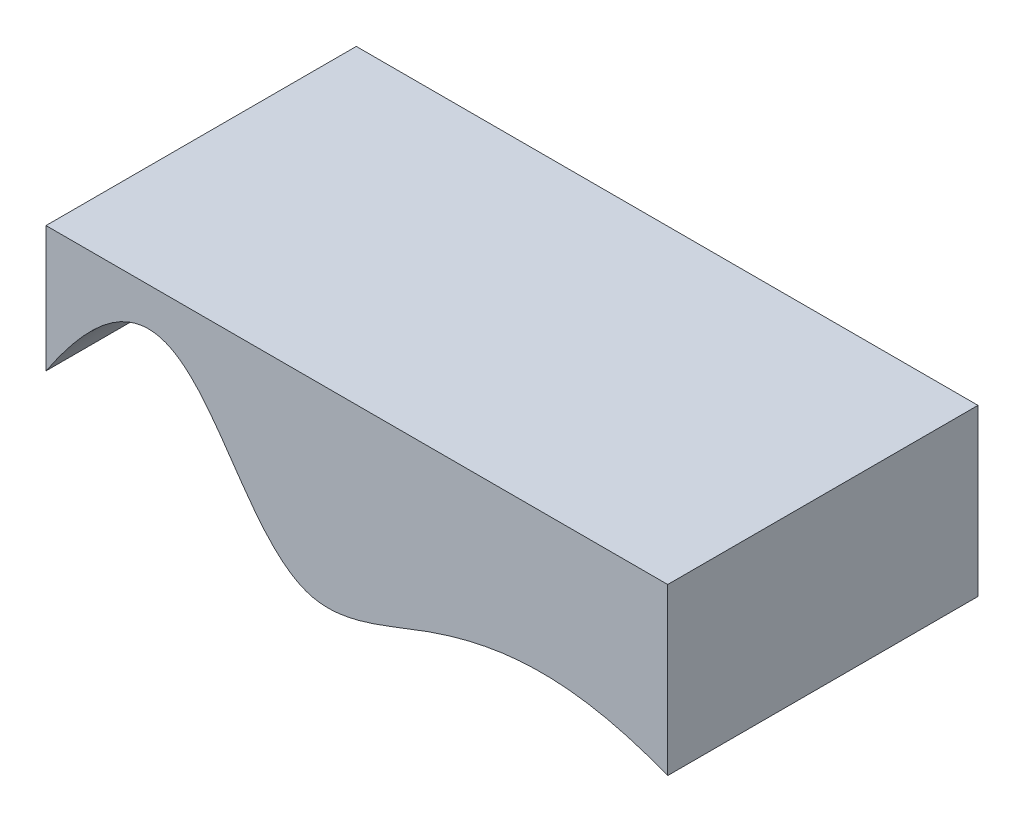
ISO-10303-21;
HEADER;
FILE_DESCRIPTION(('STEP AP214'),'2;1');
FILE_NAME('part.step','',(''),(''),'','','');
FILE_SCHEMA(('AUTOMOTIVE_DESIGN { 1 0 10303 214 1 1 1 1 }'));
ENDSEC;
DATA;
#1=APPLICATION_CONTEXT('core data for automotive mechanical design processes');
#2=APPLICATION_PROTOCOL_DEFINITION('international standard','automotive_design',2000,#1);
#3=PRODUCT_CONTEXT('',#1,'mechanical');
#4=PRODUCT('Part','Part','',(#3));
#5=PRODUCT_RELATED_PRODUCT_CATEGORY('part','',(#4));
#6=PRODUCT_DEFINITION_FORMATION('','',#4);
#7=PRODUCT_DEFINITION_CONTEXT('part definition',#1,'design');
#8=PRODUCT_DEFINITION('design','',#6,#7);
#9=PRODUCT_DEFINITION_SHAPE('','',#8);
#10=(LENGTH_UNIT() NAMED_UNIT(*) SI_UNIT(.MILLI.,.METRE.));
#11=(NAMED_UNIT(*) PLANE_ANGLE_UNIT() SI_UNIT($,.RADIAN.));
#12=(NAMED_UNIT(*) SI_UNIT($,.STERADIAN.) SOLID_ANGLE_UNIT());
#13=UNCERTAINTY_MEASURE_WITH_UNIT(LENGTH_MEASURE(1.E-05),#10,'distance_accuracy_value','');
#14=(GEOMETRIC_REPRESENTATION_CONTEXT(3) GLOBAL_UNCERTAINTY_ASSIGNED_CONTEXT((#13)) GLOBAL_UNIT_ASSIGNED_CONTEXT((#10,
#11,#12)) REPRESENTATION_CONTEXT('',''));
#15=CARTESIAN_POINT('',(0.,0.,0.));
#16=DIRECTION('',(0.,0.,1.));
#17=DIRECTION('',(1.,0.,0.));
#18=AXIS2_PLACEMENT_3D('',#15,#16,#17);
#19=CARTESIAN_POINT('',(-100.,40.5,-75.0911395420866));
#20=CARTESIAN_POINT('',(-53.0498171241233,111.136617538258,-75.0911395420866));
#21=CARTESIAN_POINT('',(-41.9028867763509,-1.15581028121237,-75.0911395420866));
#22=CARTESIAN_POINT('',(37.6600895294148,38.4643377224202,-75.0911395420866));
#23=CARTESIAN_POINT('',(71.5534586178328,38.9159371729205,-75.0911395420866));
#24=CARTESIAN_POINT('',(100.,27.7581215065662,-75.0911395420866));
#25=B_SPLINE_CURVE_WITH_KNOTS('',3,(#19,#20,#21,#22,#23,#24),.UNSPECIFIED.,.F.,.F.,(4,1,1,4),
(0.,0.479227824952904,0.645043655994682,1.),.UNSPECIFIED.);
#26=DIRECTION('',(0.,0.,1.));
#27=VECTOR('',#26,1.);
#28=SURFACE_OF_LINEAR_EXTRUSION('',#25,#27);
#29=DIRECTION('',(0.,0.,1.));
#30=VECTOR('',#29,1.);
#31=CARTESIAN_POINT('',(100.,27.7581215065662,-75.0911395420866));
#32=LINE('',#31,#30);
#33=CARTESIAN_POINT('',(100.,27.7581215065661,-49.9088604579134));
#34=VERTEX_POINT('',#33);
#35=CARTESIAN_POINT('',(100.,27.7581215065661,49.9088604579134));
#36=VERTEX_POINT('',#35);
#37=EDGE_CURVE('E126',#34,#36,#32,.T.);
#38=ORIENTED_EDGE('',*,*,#37,.T.);
#39=CARTESIAN_POINT('',(-100.,40.5,49.9088604579134));
#40=CARTESIAN_POINT('',(-53.0498171241233,111.136617538258,49.9088604579134));
#41=CARTESIAN_POINT('',(-41.9028867763509,-1.15581028121237,49.9088604579134));
#42=CARTESIAN_POINT('',(37.6600895294148,38.4643377224202,49.9088604579134));
#43=CARTESIAN_POINT('',(71.5534586178328,38.9159371729205,49.9088604579134));
#44=CARTESIAN_POINT('',(100.,27.7581215065662,49.9088604579134));
#45=B_SPLINE_CURVE_WITH_KNOTS('',3,(#39,#40,#41,#42,#43,#44),.UNSPECIFIED.,.F.,.F.,(4,1,1,4),
(0.,0.479227824952904,0.645043655994682,1.),.UNSPECIFIED.);
#46=CARTESIAN_POINT('',(-100.,40.5,49.9088604579134));
#47=VERTEX_POINT('',#46);
#48=EDGE_CURVE('E118',#36,#47,#45,.F.);
#49=ORIENTED_EDGE('',*,*,#48,.T.);
#50=DIRECTION('',(0.,0.,1.));
#51=VECTOR('',#50,1.);
#52=CARTESIAN_POINT('',(-100.,40.5,-75.0911395420866));
#53=LINE('',#52,#51);
#54=CARTESIAN_POINT('',(-100.,40.5,-49.9088604579134));
#55=VERTEX_POINT('',#54);
#56=EDGE_CURVE('E104',#47,#55,#53,.F.);
#57=ORIENTED_EDGE('',*,*,#56,.T.);
#58=CARTESIAN_POINT('',(-100.,40.5,-49.9088604579134));
#59=CARTESIAN_POINT('',(-53.0498171241233,111.136617538258,-49.9088604579134));
#60=CARTESIAN_POINT('',(-41.9028867763509,-1.15581028121237,-49.9088604579134));
#61=CARTESIAN_POINT('',(37.6600895294148,38.4643377224202,-49.9088604579134));
#62=CARTESIAN_POINT('',(71.5534586178328,38.9159371729205,-49.9088604579134));
#63=CARTESIAN_POINT('',(100.,27.7581215065662,-49.9088604579134));
#64=B_SPLINE_CURVE_WITH_KNOTS('',3,(#58,#59,#60,#61,#62,#63),.UNSPECIFIED.,.F.,.F.,(4,1,1,4),
(0.,0.479227824952904,0.645043655994682,1.),.UNSPECIFIED.);
#65=EDGE_CURVE('E116',#55,#34,#64,.T.);
#66=ORIENTED_EDGE('',*,*,#65,.T.);
#67=EDGE_LOOP('',(#38,#49,#57,#66));
#68=FACE_BOUND('',#67,.T.);
#69=ADVANCED_FACE('F59',(#68),#28,.T.);
#70=CARTESIAN_POINT('',(-100.,81.,49.9088604579134));
#71=DIRECTION('',(1.,0.,0.));
#72=DIRECTION('',(0.,0.,-1.));
#73=AXIS2_PLACEMENT_3D('',#70,#71,#72);
#74=PLANE('',#73);
#75=ORIENTED_EDGE('',*,*,#56,.F.);
#76=DIRECTION('',(0.,-1.,0.));
#77=VECTOR('',#76,1.);
#78=CARTESIAN_POINT('',(-100.,81.,49.9088604579134));
#79=LINE('',#78,#77);
#80=CARTESIAN_POINT('',(-100.,81.,49.9088604579134));
#81=VERTEX_POINT('',#80);
#82=EDGE_CURVE('E120',#81,#47,#79,.T.);
#83=ORIENTED_EDGE('',*,*,#82,.F.);
#84=DIRECTION('',(0.,0.,1.));
#85=VECTOR('',#84,1.);
#86=CARTESIAN_POINT('',(-100.,81.,49.9088604579134));
#87=LINE('',#86,#85);
#88=CARTESIAN_POINT('',(-100.,81.,-49.9088604579134));
#89=VERTEX_POINT('',#88);
#90=EDGE_CURVE('E12',#89,#81,#87,.T.);
#91=ORIENTED_EDGE('',*,*,#90,.F.);
#92=DIRECTION('',(0.,-1.,0.));
#93=VECTOR('',#92,1.);
#94=CARTESIAN_POINT('',(-100.,81.,-49.9088604579134));
#95=LINE('',#94,#93);
#96=EDGE_CURVE('E100',#89,#55,#95,.T.);
#97=ORIENTED_EDGE('',*,*,#96,.T.);
#98=EDGE_LOOP('',(#75,#83,#91,#97));
#99=FACE_BOUND('',#98,.T.);
#100=ADVANCED_FACE('F102',(#99),#74,.F.);
#101=CARTESIAN_POINT('',(-100.,81.,49.9088604579134));
#102=DIRECTION('',(0.,0.,-1.));
#103=DIRECTION('',(-1.,0.,0.));
#104=AXIS2_PLACEMENT_3D('',#101,#102,#103);
#105=PLANE('',#104);
#106=ORIENTED_EDGE('',*,*,#48,.F.);
#107=DIRECTION('',(0.,-1.,0.));
#108=VECTOR('',#107,1.);
#109=CARTESIAN_POINT('',(100.,81.,49.9088604579134));
#110=LINE('',#109,#108);
#111=CARTESIAN_POINT('',(100.,81.,49.9088604579134));
#112=VERTEX_POINT('',#111);
#113=EDGE_CURVE('E144',#112,#36,#110,.T.);
#114=ORIENTED_EDGE('',*,*,#113,.F.);
#115=DIRECTION('',(1.,0.,0.));
#116=VECTOR('',#115,1.);
#117=CARTESIAN_POINT('',(-100.,81.,49.9088604579134));
#118=LINE('',#117,#116);
#119=EDGE_CURVE('E70',#81,#112,#118,.T.);
#120=ORIENTED_EDGE('',*,*,#119,.F.);
#121=ORIENTED_EDGE('',*,*,#82,.T.);
#122=EDGE_LOOP('',(#106,#114,#120,#121));
#123=FACE_BOUND('',#122,.T.);
#124=ADVANCED_FACE('F159',(#123),#105,.F.);
#125=CARTESIAN_POINT('',(100.,81.,49.9088604579134));
#126=DIRECTION('',(-1.,0.,0.));
#127=DIRECTION('',(0.,0.,1.));
#128=AXIS2_PLACEMENT_3D('',#125,#126,#127);
#129=PLANE('',#128);
#130=ORIENTED_EDGE('',*,*,#37,.F.);
#131=DIRECTION('',(0.,-1.,0.));
#132=VECTOR('',#131,1.);
#133=CARTESIAN_POINT('',(100.,81.,-49.9088604579134));
#134=LINE('',#133,#132);
#135=CARTESIAN_POINT('',(100.,81.,-49.9088604579134));
#136=VERTEX_POINT('',#135);
#137=EDGE_CURVE('E111',#136,#34,#134,.T.);
#138=ORIENTED_EDGE('',*,*,#137,.F.);
#139=DIRECTION('',(0.,0.,-1.));
#140=VECTOR('',#139,1.);
#141=CARTESIAN_POINT('',(100.,81.,49.9088604579134));
#142=LINE('',#141,#140);
#143=EDGE_CURVE('E151',#112,#136,#142,.T.);
#144=ORIENTED_EDGE('',*,*,#143,.F.);
#145=ORIENTED_EDGE('',*,*,#113,.T.);
#146=EDGE_LOOP('',(#130,#138,#144,#145));
#147=FACE_BOUND('',#146,.T.);
#148=ADVANCED_FACE('F158',(#147),#129,.F.);
#149=CARTESIAN_POINT('',(-100.,81.,-49.9088604579134));
#150=DIRECTION('',(0.,0.,1.));
#151=DIRECTION('',(1.,0.,0.));
#152=AXIS2_PLACEMENT_3D('',#149,#150,#151);
#153=PLANE('',#152);
#154=ORIENTED_EDGE('',*,*,#65,.F.);
#155=ORIENTED_EDGE('',*,*,#96,.F.);
#156=DIRECTION('',(-1.,0.,0.));
#157=VECTOR('',#156,1.);
#158=CARTESIAN_POINT('',(-100.,81.,-49.9088604579134));
#159=LINE('',#158,#157);
#160=EDGE_CURVE('E110',#136,#89,#159,.T.);
#161=ORIENTED_EDGE('',*,*,#160,.F.);
#162=ORIENTED_EDGE('',*,*,#137,.T.);
#163=EDGE_LOOP('',(#154,#155,#161,#162));
#164=FACE_BOUND('',#163,.T.);
#165=ADVANCED_FACE('F122',(#164),#153,.F.);
#166=CARTESIAN_POINT('',(0.,81.,0.));
#167=DIRECTION('',(0.,-1.,0.));
#168=DIRECTION('',(0.,0.,-1.));
#169=AXIS2_PLACEMENT_3D('',#166,#167,#168);
#170=PLANE('',#169);
#171=ORIENTED_EDGE('',*,*,#90,.T.);
#172=ORIENTED_EDGE('',*,*,#119,.T.);
#173=ORIENTED_EDGE('',*,*,#143,.T.);
#174=ORIENTED_EDGE('',*,*,#160,.T.);
#175=EDGE_LOOP('',(#171,#172,#173,#174));
#176=FACE_BOUND('',#175,.T.);
#177=ADVANCED_FACE('F155',(#176),#170,.F.);
#178=CLOSED_SHELL('',(#69,#100,#124,#148,#165,#177));
#179=MANIFOLD_SOLID_BREP('B2',#178);
#180=ADVANCED_BREP_SHAPE_REPRESENTATION('',(#18,#179),#14);
#181=SHAPE_DEFINITION_REPRESENTATION(#9,#180);
ENDSEC;
END-ISO-10303-21;
